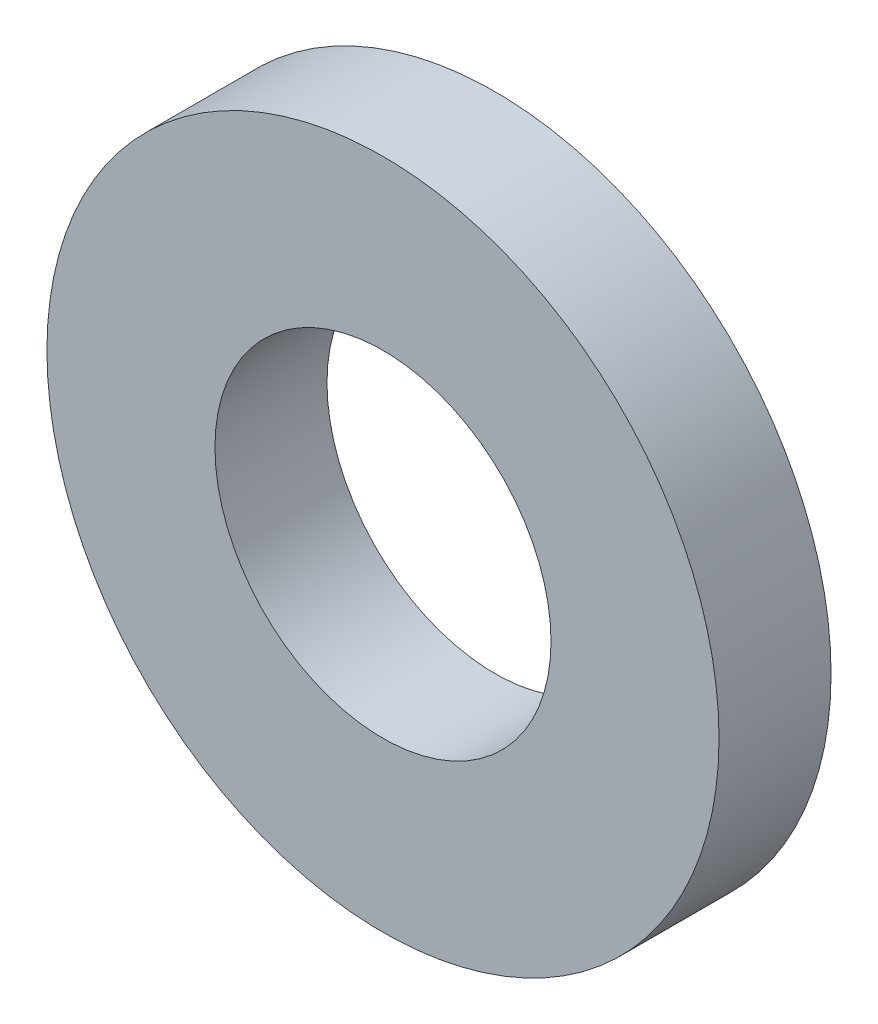
ISO-10303-21;
HEADER;
FILE_DESCRIPTION(('STEP AP214'),'2;1');
FILE_NAME('part.step','',(''),(''),'','','');
FILE_SCHEMA(('AUTOMOTIVE_DESIGN { 1 0 10303 214 1 1 1 1 }'));
ENDSEC;
DATA;
#1=APPLICATION_CONTEXT('core data for automotive mechanical design processes');
#2=APPLICATION_PROTOCOL_DEFINITION('international standard','automotive_design',2000,#1);
#3=PRODUCT_CONTEXT('',#1,'mechanical');
#4=PRODUCT('Part','Part','',(#3));
#5=PRODUCT_RELATED_PRODUCT_CATEGORY('part','',(#4));
#6=PRODUCT_DEFINITION_FORMATION('','',#4);
#7=PRODUCT_DEFINITION_CONTEXT('part definition',#1,'design');
#8=PRODUCT_DEFINITION('design','',#6,#7);
#9=PRODUCT_DEFINITION_SHAPE('','',#8);
#10=(LENGTH_UNIT() NAMED_UNIT(*) SI_UNIT(.MILLI.,.METRE.));
#11=(NAMED_UNIT(*) PLANE_ANGLE_UNIT() SI_UNIT($,.RADIAN.));
#12=(NAMED_UNIT(*) SI_UNIT($,.STERADIAN.) SOLID_ANGLE_UNIT());
#13=UNCERTAINTY_MEASURE_WITH_UNIT(LENGTH_MEASURE(1.E-05),#10,'distance_accuracy_value','');
#14=(GEOMETRIC_REPRESENTATION_CONTEXT(3) GLOBAL_UNCERTAINTY_ASSIGNED_CONTEXT((#13)) GLOBAL_UNIT_ASSIGNED_CONTEXT((#10,
#11,#12)) REPRESENTATION_CONTEXT('',''));
#15=CARTESIAN_POINT('',(0.,0.,0.));
#16=DIRECTION('',(0.,0.,1.));
#17=DIRECTION('',(1.,0.,0.));
#18=AXIS2_PLACEMENT_3D('',#15,#16,#17);
#19=CARTESIAN_POINT('',(0.,0.,10.));
#20=DIRECTION('',(0.,0.,1.));
#21=DIRECTION('',(1.,0.,0.));
#22=AXIS2_PLACEMENT_3D('',#19,#20,#21);
#23=PLANE('',#22);
#24=CARTESIAN_POINT('',(0.,0.,10.));
#25=DIRECTION('',(0.,0.,1.));
#26=DIRECTION('',(1.,0.,0.));
#27=AXIS2_PLACEMENT_3D('',#24,#25,#26);
#28=CIRCLE('',#27,30.);
#29=CARTESIAN_POINT('',(30.,0.,10.));
#30=VERTEX_POINT('',#29);
#31=EDGE_CURVE('E10',#30,#30,#28,.T.);
#32=ORIENTED_EDGE('',*,*,#31,.T.);
#33=EDGE_LOOP('',(#32));
#34=FACE_BOUND('',#33,.T.);
#35=CARTESIAN_POINT('',(0.,0.,10.));
#36=DIRECTION('',(0.,0.,1.));
#37=DIRECTION('',(1.,0.,0.));
#38=AXIS2_PLACEMENT_3D('',#35,#36,#37);
#39=CIRCLE('',#38,15.);
#40=CARTESIAN_POINT('',(15.,0.,10.));
#41=VERTEX_POINT('',#40);
#42=EDGE_CURVE('E50',#41,#41,#39,.T.);
#43=ORIENTED_EDGE('',*,*,#42,.F.);
#44=EDGE_LOOP('',(#43));
#45=FACE_BOUND('',#44,.T.);
#46=ADVANCED_FACE('F37',(#34,#45),#23,.T.);
#47=CARTESIAN_POINT('',(0.,0.,0.));
#48=DIRECTION('',(0.,0.,1.));
#49=DIRECTION('',(1.,0.,0.));
#50=AXIS2_PLACEMENT_3D('',#47,#48,#49);
#51=PLANE('',#50);
#52=CARTESIAN_POINT('',(0.,0.,0.));
#53=DIRECTION('',(0.,0.,1.));
#54=DIRECTION('',(1.,0.,0.));
#55=AXIS2_PLACEMENT_3D('',#52,#53,#54);
#56=CIRCLE('',#55,30.);
#57=CARTESIAN_POINT('',(30.,0.,0.));
#58=VERTEX_POINT('',#57);
#59=EDGE_CURVE('E41',#58,#58,#56,.T.);
#60=ORIENTED_EDGE('',*,*,#59,.F.);
#61=EDGE_LOOP('',(#60));
#62=FACE_BOUND('',#61,.T.);
#63=CARTESIAN_POINT('',(0.,0.,0.));
#64=DIRECTION('',(0.,0.,1.));
#65=DIRECTION('',(1.,0.,0.));
#66=AXIS2_PLACEMENT_3D('',#63,#64,#65);
#67=CIRCLE('',#66,15.);
#68=CARTESIAN_POINT('',(15.,0.,0.));
#69=VERTEX_POINT('',#68);
#70=EDGE_CURVE('E52',#69,#69,#67,.T.);
#71=ORIENTED_EDGE('',*,*,#70,.T.);
#72=EDGE_LOOP('',(#71));
#73=FACE_BOUND('',#72,.T.);
#74=ADVANCED_FACE('F64',(#62,#73),#51,.F.);
#75=CARTESIAN_POINT('',(0.,0.,10.));
#76=DIRECTION('',(0.,0.,-1.));
#77=DIRECTION('',(-1.,0.,0.));
#78=AXIS2_PLACEMENT_3D('',#75,#76,#77);
#79=CYLINDRICAL_SURFACE('',#78,30.);
#80=ORIENTED_EDGE('',*,*,#31,.F.);
#81=EDGE_LOOP('',(#80));
#82=FACE_BOUND('',#81,.T.);
#83=ORIENTED_EDGE('',*,*,#59,.T.);
#84=EDGE_LOOP('',(#83));
#85=FACE_BOUND('',#84,.T.);
#86=ADVANCED_FACE('F39',(#82,#85),#79,.T.);
#87=CARTESIAN_POINT('',(0.,0.,10.));
#88=DIRECTION('',(0.,0.,-1.));
#89=DIRECTION('',(-1.,0.,0.));
#90=AXIS2_PLACEMENT_3D('',#87,#88,#89);
#91=CYLINDRICAL_SURFACE('',#90,15.);
#92=ORIENTED_EDGE('',*,*,#42,.T.);
#93=EDGE_LOOP('',(#92));
#94=FACE_BOUND('',#93,.T.);
#95=ORIENTED_EDGE('',*,*,#70,.F.);
#96=EDGE_LOOP('',(#95));
#97=FACE_BOUND('',#96,.T.);
#98=ADVANCED_FACE('F60',(#94,#97),#91,.F.);
#99=CLOSED_SHELL('',(#46,#74,#86,#98));
#100=MANIFOLD_SOLID_BREP('B2',#99);
#101=ADVANCED_BREP_SHAPE_REPRESENTATION('',(#18,#100),#14);
#102=SHAPE_DEFINITION_REPRESENTATION(#9,#101);
ENDSEC;
END-ISO-10303-21;
